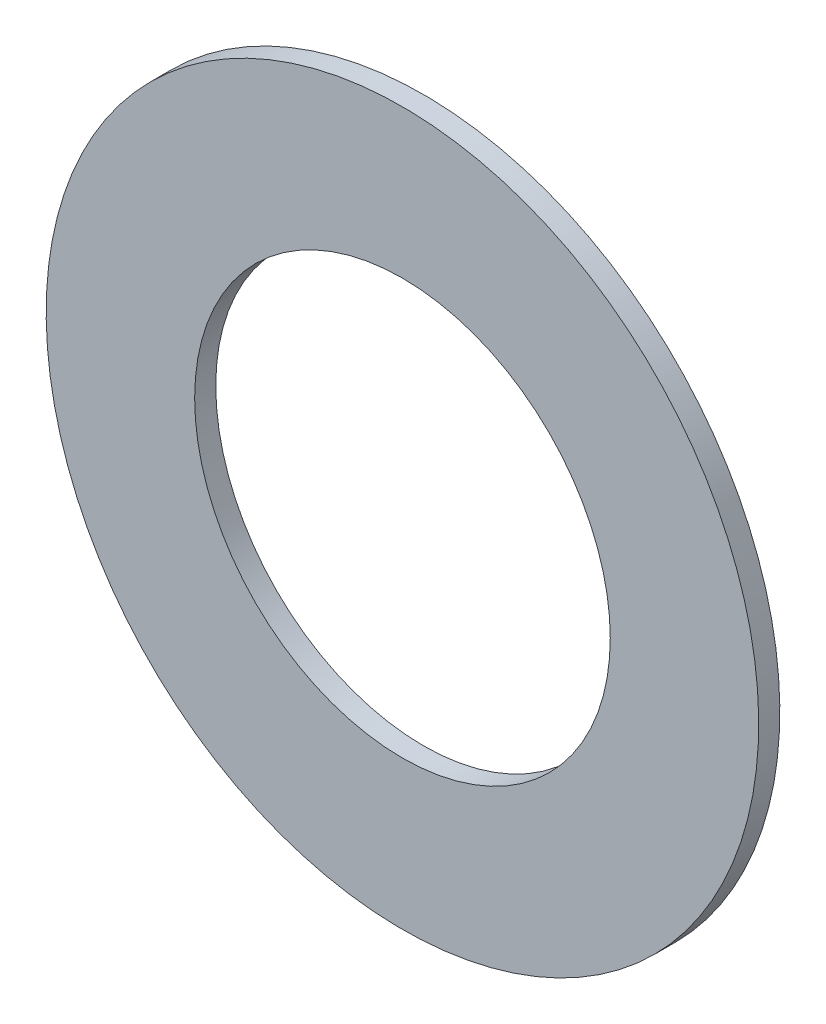
ISO-10303-21;
HEADER;
FILE_DESCRIPTION(('STEP AP214'),'2;1');
FILE_NAME('part.step','',(''),(''),'','','');
FILE_SCHEMA(('AUTOMOTIVE_DESIGN { 1 0 10303 214 1 1 1 1 }'));
ENDSEC;
DATA;
#1=APPLICATION_CONTEXT('core data for automotive mechanical design processes');
#2=APPLICATION_PROTOCOL_DEFINITION('international standard','automotive_design',2000,#1);
#3=PRODUCT_CONTEXT('',#1,'mechanical');
#4=PRODUCT('Part','Part','',(#3));
#5=PRODUCT_RELATED_PRODUCT_CATEGORY('part','',(#4));
#6=PRODUCT_DEFINITION_FORMATION('','',#4);
#7=PRODUCT_DEFINITION_CONTEXT('part definition',#1,'design');
#8=PRODUCT_DEFINITION('design','',#6,#7);
#9=PRODUCT_DEFINITION_SHAPE('','',#8);
#10=(LENGTH_UNIT() NAMED_UNIT(*) SI_UNIT(.MILLI.,.METRE.));
#11=(NAMED_UNIT(*) PLANE_ANGLE_UNIT() SI_UNIT($,.RADIAN.));
#12=(NAMED_UNIT(*) SI_UNIT($,.STERADIAN.) SOLID_ANGLE_UNIT());
#13=UNCERTAINTY_MEASURE_WITH_UNIT(LENGTH_MEASURE(1.E-05),#10,'distance_accuracy_value','');
#14=(GEOMETRIC_REPRESENTATION_CONTEXT(3) GLOBAL_UNCERTAINTY_ASSIGNED_CONTEXT((#13)) GLOBAL_UNIT_ASSIGNED_CONTEXT((#10,
#11,#12)) REPRESENTATION_CONTEXT('',''));
#15=CARTESIAN_POINT('',(0.,0.,0.));
#16=DIRECTION('',(0.,0.,1.));
#17=DIRECTION('',(1.,0.,0.));
#18=AXIS2_PLACEMENT_3D('',#15,#16,#17);
#19=CARTESIAN_POINT('',(110.89084502,94.87577418,0.));
#20=DIRECTION('',(-0.707106781186548,0.707106781186548,0.));
#21=DIRECTION('',(0.707106781186548,0.707106781186548,0.));
#22=AXIS2_PLACEMENT_3D('',#19,#20,#21);
#23=PLANE('',#22);
#24=DIRECTION('',(0.707106781186548,0.707106781186548,0.));
#25=VECTOR('',#24,1.);
#26=CARTESIAN_POINT('',(110.89084502,94.87577418,0.03556));
#27=LINE('',#26,#25);
#28=CARTESIAN_POINT('',(110.89084502,94.87577418,0.03556));
#29=VERTEX_POINT('',#28);
#30=CARTESIAN_POINT('',(110.89089582,94.87582498,0.03556));
#31=VERTEX_POINT('',#30);
#32=EDGE_CURVE('E11',#29,#31,#27,.T.);
#33=ORIENTED_EDGE('',*,*,#32,.F.);
#34=DIRECTION('',(0.,0.,1.));
#35=VECTOR('',#34,1.);
#36=CARTESIAN_POINT('',(110.89084502,94.87577418,0.));
#37=LINE('',#36,#35);
#38=CARTESIAN_POINT('',(110.89084502,94.87577418,0.));
#39=VERTEX_POINT('',#38);
#40=EDGE_CURVE('E24',#39,#29,#37,.T.);
#41=ORIENTED_EDGE('',*,*,#40,.F.);
#42=DIRECTION('',(0.707106781186548,0.707106781186548,0.));
#43=VECTOR('',#42,1.);
#44=CARTESIAN_POINT('',(110.89084502,94.87577418,0.));
#45=LINE('',#44,#43);
#46=CARTESIAN_POINT('',(110.89089582,94.87582498,0.));
#47=VERTEX_POINT('',#46);
#48=EDGE_CURVE('E96',#39,#47,#45,.T.);
#49=ORIENTED_EDGE('',*,*,#48,.T.);
#50=DIRECTION('',(0.,0.,1.));
#51=VECTOR('',#50,1.);
#52=CARTESIAN_POINT('',(110.89089582,94.87582498,0.));
#53=LINE('',#52,#51);
#54=EDGE_CURVE('E37',#47,#31,#53,.T.);
#55=ORIENTED_EDGE('',*,*,#54,.T.);
#56=EDGE_LOOP('',(#33,#41,#49,#55));
#57=FACE_BOUND('',#56,.T.);
#58=ADVANCED_FACE('F17',(#57),#23,.F.);
#59=CARTESIAN_POINT('',(110.4665812,95.300038,0.));
#60=DIRECTION('',(0.,0.,-1.));
#61=DIRECTION('',(-0.707106781186548,0.707106781186548,0.));
#62=AXIS2_PLACEMENT_3D('',#59,#60,#61);
#63=CYLINDRICAL_SURFACE('',#62,0.599999648268215);
#64=CARTESIAN_POINT('',(110.4665812,95.300038,0.03556));
#65=DIRECTION('',(0.,0.,1.));
#66=DIRECTION('',(-0.707106781186548,0.707106781186548,0.));
#67=AXIS2_PLACEMENT_3D('',#64,#65,#66);
#68=CIRCLE('',#67,0.599999648268215);
#69=CARTESIAN_POINT('',(110.04231738,95.72430182,0.03556));
#70=VERTEX_POINT('',#69);
#71=EDGE_CURVE('E92',#70,#29,#68,.T.);
#72=ORIENTED_EDGE('',*,*,#71,.F.);
#73=DIRECTION('',(0.,0.,1.));
#74=VECTOR('',#73,1.);
#75=CARTESIAN_POINT('',(110.04231738,95.72430182,0.));
#76=LINE('',#75,#74);
#77=CARTESIAN_POINT('',(110.04231738,95.72430182,0.));
#78=VERTEX_POINT('',#77);
#79=EDGE_CURVE('E90',#78,#70,#76,.T.);
#80=ORIENTED_EDGE('',*,*,#79,.F.);
#81=CARTESIAN_POINT('',(110.4665812,95.300038,0.));
#82=DIRECTION('',(0.,0.,1.));
#83=DIRECTION('',(-0.707106781186548,0.707106781186548,0.));
#84=AXIS2_PLACEMENT_3D('',#81,#82,#83);
#85=CIRCLE('',#84,0.599999648268215);
#86=EDGE_CURVE('E88',#78,#39,#85,.T.);
#87=ORIENTED_EDGE('',*,*,#86,.T.);
#88=ORIENTED_EDGE('',*,*,#40,.T.);
#89=EDGE_LOOP('',(#72,#80,#87,#88));
#90=FACE_BOUND('',#89,.T.);
#91=ADVANCED_FACE('F111',(#90),#63,.T.);
#92=CARTESIAN_POINT('',(110.466632,95.3000888,0.));
#93=DIRECTION('',(0.,0.,-1.));
#94=DIRECTION('',(0.707106781186548,-0.707106781186548,0.));
#95=AXIS2_PLACEMENT_3D('',#92,#93,#94);
#96=CYLINDRICAL_SURFACE('',#95,0.599999648268211);
#97=CARTESIAN_POINT('',(110.466632,95.3000888,0.03556));
#98=DIRECTION('',(0.,0.,1.));
#99=DIRECTION('',(0.707106781186548,-0.707106781186548,0.));
#100=AXIS2_PLACEMENT_3D('',#97,#98,#99);
#101=CIRCLE('',#100,0.599999648268211);
#102=CARTESIAN_POINT('',(110.04236818,95.72435262,0.03556));
#103=VERTEX_POINT('',#102);
#104=EDGE_CURVE('E85',#31,#103,#101,.T.);
#105=ORIENTED_EDGE('',*,*,#104,.F.);
#106=ORIENTED_EDGE('',*,*,#54,.F.);
#107=CARTESIAN_POINT('',(110.466632,95.3000888,0.));
#108=DIRECTION('',(0.,0.,1.));
#109=DIRECTION('',(0.707106781186548,-0.707106781186548,0.));
#110=AXIS2_PLACEMENT_3D('',#107,#108,#109);
#111=CIRCLE('',#110,0.599999648268211);
#112=CARTESIAN_POINT('',(110.04236818,95.72435262,0.));
#113=VERTEX_POINT('',#112);
#114=EDGE_CURVE('E82',#47,#113,#111,.T.);
#115=ORIENTED_EDGE('',*,*,#114,.T.);
#116=DIRECTION('',(0.,0.,1.));
#117=VECTOR('',#116,1.);
#118=CARTESIAN_POINT('',(110.04236818,95.72435262,0.));
#119=LINE('',#118,#117);
#120=EDGE_CURVE('E80',#113,#103,#119,.T.);
#121=ORIENTED_EDGE('',*,*,#120,.T.);
#122=EDGE_LOOP('',(#105,#106,#115,#121));
#123=FACE_BOUND('',#122,.T.);
#124=ADVANCED_FACE('F104',(#123),#96,.T.);
#125=CARTESIAN_POINT('',(110.04236818,95.72435262,0.));
#126=DIRECTION('',(0.707106781186548,-0.707106781186548,0.));
#127=DIRECTION('',(-0.707106781186548,-0.707106781186548,0.));
#128=AXIS2_PLACEMENT_3D('',#125,#126,#127);
#129=PLANE('',#128);
#130=DIRECTION('',(-0.707106781186548,-0.707106781186548,0.));
#131=VECTOR('',#130,1.);
#132=CARTESIAN_POINT('',(110.04236818,95.72435262,0.03556));
#133=LINE('',#132,#131);
#134=EDGE_CURVE('E77',#103,#70,#133,.T.);
#135=ORIENTED_EDGE('',*,*,#134,.F.);
#136=ORIENTED_EDGE('',*,*,#120,.F.);
#137=DIRECTION('',(-0.707106781186548,-0.707106781186548,0.));
#138=VECTOR('',#137,1.);
#139=CARTESIAN_POINT('',(110.04236818,95.72435262,0.));
#140=LINE('',#139,#138);
#141=EDGE_CURVE('E68',#113,#78,#140,.T.);
#142=ORIENTED_EDGE('',*,*,#141,.T.);
#143=ORIENTED_EDGE('',*,*,#79,.T.);
#144=EDGE_LOOP('',(#135,#136,#142,#143));
#145=FACE_BOUND('',#144,.T.);
#146=ADVANCED_FACE('F110',(#145),#129,.F.);
#147=CARTESIAN_POINT('',(110.466632,95.3000888,0.));
#148=DIRECTION('',(0.,0.,-1.));
#149=DIRECTION('',(1.,0.,0.));
#150=AXIS2_PLACEMENT_3D('',#147,#148,#149);
#151=CYLINDRICAL_SURFACE('',#150,0.3499993);
#152=DIRECTION('',(0.,0.,1.));
#153=VECTOR('',#152,1.);
#154=CARTESIAN_POINT('',(110.8166313,95.3000888,0.));
#155=LINE('',#154,#153);
#156=CARTESIAN_POINT('',(110.8166313,95.3000888,0.));
#157=VERTEX_POINT('',#156);
#158=CARTESIAN_POINT('',(110.8166313,95.3000888,0.03556));
#159=VERTEX_POINT('',#158);
#160=EDGE_CURVE('E62',#157,#159,#155,.T.);
#161=ORIENTED_EDGE('',*,*,#160,.T.);
#162=CARTESIAN_POINT('',(110.466632,95.3000888,0.03556));
#163=DIRECTION('',(0.,0.,1.));
#164=DIRECTION('',(1.,0.,0.));
#165=AXIS2_PLACEMENT_3D('',#162,#163,#164);
#166=CIRCLE('',#165,0.3499993);
#167=EDGE_CURVE('E67',#159,#159,#166,.T.);
#168=ORIENTED_EDGE('',*,*,#167,.T.);
#169=ORIENTED_EDGE('',*,*,#160,.F.);
#170=CARTESIAN_POINT('',(110.466632,95.3000888,0.));
#171=DIRECTION('',(0.,0.,1.));
#172=DIRECTION('',(1.,0.,0.));
#173=AXIS2_PLACEMENT_3D('',#170,#171,#172);
#174=CIRCLE('',#173,0.3499993);
#175=EDGE_CURVE('E65',#157,#157,#174,.T.);
#176=ORIENTED_EDGE('',*,*,#175,.F.);
#177=EDGE_LOOP('',(#161,#168,#169,#176));
#178=FACE_BOUND('',#177,.T.);
#179=ADVANCED_FACE('F64',(#178),#151,.F.);
#180=CARTESIAN_POINT('',(110.89084502,94.87577418,0.));
#181=DIRECTION('',(0.,0.,-1.));
#182=DIRECTION('',(-1.,0.,0.));
#183=AXIS2_PLACEMENT_3D('',#180,#181,#182);
#184=PLANE('',#183);
#185=ORIENTED_EDGE('',*,*,#48,.F.);
#186=ORIENTED_EDGE('',*,*,#86,.F.);
#187=ORIENTED_EDGE('',*,*,#141,.F.);
#188=ORIENTED_EDGE('',*,*,#114,.F.);
#189=EDGE_LOOP('',(#185,#186,#187,#188));
#190=FACE_BOUND('',#189,.T.);
#191=ORIENTED_EDGE('',*,*,#175,.T.);
#192=EDGE_LOOP('',(#191));
#193=FACE_BOUND('',#192,.T.);
#194=ADVANCED_FACE('F71',(#190,#193),#184,.T.);
#195=CARTESIAN_POINT('',(110.89084502,94.87577418,0.03556));
#196=DIRECTION('',(0.,0.,-1.));
#197=DIRECTION('',(-1.,0.,0.));
#198=AXIS2_PLACEMENT_3D('',#195,#196,#197);
#199=PLANE('',#198);
#200=ORIENTED_EDGE('',*,*,#134,.T.);
#201=ORIENTED_EDGE('',*,*,#71,.T.);
#202=ORIENTED_EDGE('',*,*,#32,.T.);
#203=ORIENTED_EDGE('',*,*,#104,.T.);
#204=EDGE_LOOP('',(#200,#201,#202,#203));
#205=FACE_BOUND('',#204,.T.);
#206=ORIENTED_EDGE('',*,*,#167,.F.);
#207=EDGE_LOOP('',(#206));
#208=FACE_BOUND('',#207,.T.);
#209=ADVANCED_FACE('F107',(#205,#208),#199,.F.);
#210=CLOSED_SHELL('',(#58,#91,#124,#146,#179,#194,#209));
#211=MANIFOLD_SOLID_BREP('B1',#210);
#212=ADVANCED_BREP_SHAPE_REPRESENTATION('',(#18,#211),#14);
#213=SHAPE_DEFINITION_REPRESENTATION(#9,#212);
ENDSEC;
END-ISO-10303-21;
